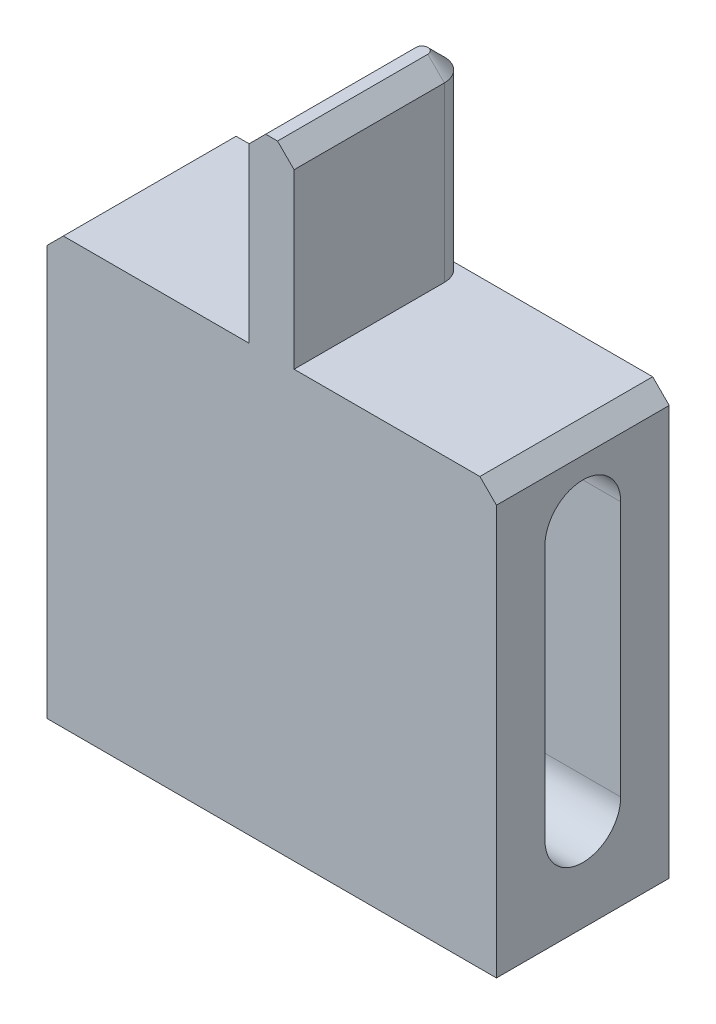
ISO-10303-21;
HEADER;
FILE_DESCRIPTION(('STEP AP214'),'2;1');
FILE_NAME('part.step','',(''),(''),'','','');
FILE_SCHEMA(('AUTOMOTIVE_DESIGN { 1 0 10303 214 1 1 1 1 }'));
ENDSEC;
DATA;
#1=APPLICATION_CONTEXT('core data for automotive mechanical design processes');
#2=APPLICATION_PROTOCOL_DEFINITION('international standard','automotive_design',2000,#1);
#3=PRODUCT_CONTEXT('',#1,'mechanical');
#4=PRODUCT('Part','Part','',(#3));
#5=PRODUCT_RELATED_PRODUCT_CATEGORY('part','',(#4));
#6=PRODUCT_DEFINITION_FORMATION('','',#4);
#7=PRODUCT_DEFINITION_CONTEXT('part definition',#1,'design');
#8=PRODUCT_DEFINITION('design','',#6,#7);
#9=PRODUCT_DEFINITION_SHAPE('','',#8);
#10=(LENGTH_UNIT() NAMED_UNIT(*) SI_UNIT(.MILLI.,.METRE.));
#11=(NAMED_UNIT(*) PLANE_ANGLE_UNIT() SI_UNIT($,.RADIAN.));
#12=(NAMED_UNIT(*) SI_UNIT($,.STERADIAN.) SOLID_ANGLE_UNIT());
#13=UNCERTAINTY_MEASURE_WITH_UNIT(LENGTH_MEASURE(1.E-05),#10,'distance_accuracy_value','');
#14=(GEOMETRIC_REPRESENTATION_CONTEXT(3) GLOBAL_UNCERTAINTY_ASSIGNED_CONTEXT((#13)) GLOBAL_UNIT_ASSIGNED_CONTEXT((#10,
#11,#12)) REPRESENTATION_CONTEXT('',''));
#15=CARTESIAN_POINT('',(0.,0.,0.));
#16=DIRECTION('',(0.,0.,1.));
#17=DIRECTION('',(1.,0.,0.));
#18=AXIS2_PLACEMENT_3D('',#15,#16,#17);
#19=CARTESIAN_POINT('',(8.54999999999998,26.,7.3));
#20=DIRECTION('',(0.,-1.,0.));
#21=DIRECTION('',(0.,0.,-1.));
#22=AXIS2_PLACEMENT_3D('',#19,#20,#21);
#23=PLANE('',#22);
#24=DIRECTION('',(-1.,0.,0.));
#25=VECTOR('',#24,1.);
#26=CARTESIAN_POINT('',(8.54999999999998,26.,7.3));
#27=LINE('',#26,#25);
#28=CARTESIAN_POINT('',(9.74999999999999,26.,7.3));
#29=VERTEX_POINT('',#28);
#30=CARTESIAN_POINT('',(9.24999999999998,26.,7.3));
#31=VERTEX_POINT('',#30);
#32=EDGE_CURVE('E217',#29,#31,#27,.T.);
#33=ORIENTED_EDGE('',*,*,#32,.F.);
#34=DIRECTION('',(0.,0.,-1.));
#35=VECTOR('',#34,1.);
#36=CARTESIAN_POINT('',(9.74999999999999,26.,7.3));
#37=LINE('',#36,#35);
#38=CARTESIAN_POINT('',(9.74999999999998,26.,0.95));
#39=VERTEX_POINT('',#38);
#40=EDGE_CURVE('E259',#29,#39,#37,.T.);
#41=ORIENTED_EDGE('',*,*,#40,.T.);
#42=CARTESIAN_POINT('',(9.49999999999998,26.,0.95));
#43=DIRECTION('',(0.,-1.,0.));
#44=DIRECTION('',(0.,0.,-1.));
#45=AXIS2_PLACEMENT_3D('',#42,#43,#44);
#46=CIRCLE('',#45,0.25);
#47=CARTESIAN_POINT('',(9.24999999999998,26.,0.95));
#48=VERTEX_POINT('',#47);
#49=EDGE_CURVE('E257',#39,#48,#46,.F.);
#50=ORIENTED_EDGE('',*,*,#49,.T.);
#51=DIRECTION('',(0.,0.,1.));
#52=VECTOR('',#51,1.);
#53=CARTESIAN_POINT('',(9.24999999999998,26.,7.3));
#54=LINE('',#53,#52);
#55=EDGE_CURVE('E255',#48,#31,#54,.T.);
#56=ORIENTED_EDGE('',*,*,#55,.T.);
#57=EDGE_LOOP('',(#33,#41,#50,#56));
#58=FACE_BOUND('',#57,.T.);
#59=ADVANCED_FACE('F35',(#58),#23,.F.);
#60=CARTESIAN_POINT('',(10.45,18.,7.3));
#61=DIRECTION('',(-1.,0.,0.));
#62=DIRECTION('',(0.,0.,1.));
#63=AXIS2_PLACEMENT_3D('',#60,#61,#62);
#64=PLANE('',#63);
#65=DIRECTION('',(0.,1.,0.));
#66=VECTOR('',#65,1.);
#67=CARTESIAN_POINT('',(10.45,16.6564971157456,0.95));
#68=LINE('',#67,#66);
#69=CARTESIAN_POINT('',(10.45,18.,0.95));
#70=VERTEX_POINT('',#69);
#71=CARTESIAN_POINT('',(10.45,25.3,0.95));
#72=VERTEX_POINT('',#71);
#73=EDGE_CURVE('E194',#70,#72,#68,.T.);
#74=ORIENTED_EDGE('',*,*,#73,.T.);
#75=DIRECTION('',(0.,0.,1.));
#76=VECTOR('',#75,1.);
#77=CARTESIAN_POINT('',(10.45,25.3,7.3));
#78=LINE('',#77,#76);
#79=CARTESIAN_POINT('',(10.45,25.3,7.3));
#80=VERTEX_POINT('',#79);
#81=EDGE_CURVE('E262',#72,#80,#78,.T.);
#82=ORIENTED_EDGE('',*,*,#81,.T.);
#83=DIRECTION('',(0.,1.,0.));
#84=VECTOR('',#83,1.);
#85=CARTESIAN_POINT('',(10.45,18.,7.3));
#86=LINE('',#85,#84);
#87=CARTESIAN_POINT('',(10.45,18.,7.3));
#88=VERTEX_POINT('',#87);
#89=EDGE_CURVE('E214',#88,#80,#86,.T.);
#90=ORIENTED_EDGE('',*,*,#89,.F.);
#91=DIRECTION('',(0.,0.,-1.));
#92=VECTOR('',#91,1.);
#93=CARTESIAN_POINT('',(10.45,18.,7.3));
#94=LINE('',#93,#92);
#95=EDGE_CURVE('E237',#88,#70,#94,.T.);
#96=ORIENTED_EDGE('',*,*,#95,.T.);
#97=EDGE_LOOP('',(#74,#82,#90,#96));
#98=FACE_BOUND('',#97,.T.);
#99=ADVANCED_FACE('F340',(#98),#64,.F.);
#100=CARTESIAN_POINT('',(0.,0.,7.3));
#101=DIRECTION('',(1.,0.,0.));
#102=DIRECTION('',(0.,0.,-1.));
#103=AXIS2_PLACEMENT_3D('',#100,#101,#102);
#104=PLANE('',#103);
#105=DIRECTION('',(0.,1.,0.));
#106=VECTOR('',#105,1.);
#107=CARTESIAN_POINT('',(0.,14.8,2.05));
#108=LINE('',#107,#106);
#109=CARTESIAN_POINT('',(0.,4.,2.05));
#110=VERTEX_POINT('',#109);
#111=CARTESIAN_POINT('',(0.,14.8,2.05));
#112=VERTEX_POINT('',#111);
#113=EDGE_CURVE('E166',#110,#112,#108,.T.);
#114=ORIENTED_EDGE('',*,*,#113,.T.);
#115=CARTESIAN_POINT('',(0.,14.8,3.65));
#116=DIRECTION('',(1.,0.,0.));
#117=DIRECTION('',(0.,0.,-1.));
#118=AXIS2_PLACEMENT_3D('',#115,#116,#117);
#119=CIRCLE('',#118,1.6);
#120=CARTESIAN_POINT('',(0.,14.8,5.25));
#121=VERTEX_POINT('',#120);
#122=EDGE_CURVE('E159',#112,#121,#119,.T.);
#123=ORIENTED_EDGE('',*,*,#122,.T.);
#124=DIRECTION('',(0.,-1.,0.));
#125=VECTOR('',#124,1.);
#126=CARTESIAN_POINT('',(0.,14.8,5.25));
#127=LINE('',#126,#125);
#128=CARTESIAN_POINT('',(0.,4.,5.25));
#129=VERTEX_POINT('',#128);
#130=EDGE_CURVE('E170',#121,#129,#127,.T.);
#131=ORIENTED_EDGE('',*,*,#130,.T.);
#132=CARTESIAN_POINT('',(0.,4.,3.65));
#133=DIRECTION('',(1.,0.,0.));
#134=DIRECTION('',(0.,0.,-1.));
#135=AXIS2_PLACEMENT_3D('',#132,#133,#134);
#136=CIRCLE('',#135,1.6);
#137=EDGE_CURVE('E175',#129,#110,#136,.T.);
#138=ORIENTED_EDGE('',*,*,#137,.T.);
#139=EDGE_LOOP('',(#114,#123,#131,#138));
#140=FACE_BOUND('',#139,.T.);
#141=DIRECTION('',(0.,-1.,0.));
#142=VECTOR('',#141,1.);
#143=CARTESIAN_POINT('',(0.,0.,7.3));
#144=LINE('',#143,#142);
#145=CARTESIAN_POINT('',(0.,17.3,7.3));
#146=VERTEX_POINT('',#145);
#147=CARTESIAN_POINT('',(0.,0.,7.3));
#148=VERTEX_POINT('',#147);
#149=EDGE_CURVE('E204',#146,#148,#144,.T.);
#150=ORIENTED_EDGE('',*,*,#149,.F.);
#151=DIRECTION('',(0.,0.,-1.));
#152=VECTOR('',#151,1.);
#153=CARTESIAN_POINT('',(0.,17.3,7.3));
#154=LINE('',#153,#152);
#155=CARTESIAN_POINT('',(0.,17.3,0.));
#156=VERTEX_POINT('',#155);
#157=EDGE_CURVE('E276',#146,#156,#154,.T.);
#158=ORIENTED_EDGE('',*,*,#157,.T.);
#159=DIRECTION('',(0.,-1.,0.));
#160=VECTOR('',#159,1.);
#161=CARTESIAN_POINT('',(0.,0.,0.));
#162=LINE('',#161,#160);
#163=CARTESIAN_POINT('',(0.,0.,0.));
#164=VERTEX_POINT('',#163);
#165=EDGE_CURVE('E201',#156,#164,#162,.T.);
#166=ORIENTED_EDGE('',*,*,#165,.T.);
#167=DIRECTION('',(0.,0.,-1.));
#168=VECTOR('',#167,1.);
#169=CARTESIAN_POINT('',(0.,0.,7.3));
#170=LINE('',#169,#168);
#171=EDGE_CURVE('E243',#148,#164,#170,.T.);
#172=ORIENTED_EDGE('',*,*,#171,.F.);
#173=EDGE_LOOP('',(#150,#158,#166,#172));
#174=FACE_BOUND('',#173,.T.);
#175=ADVANCED_FACE('F177',(#140,#174),#104,.F.);
#176=CARTESIAN_POINT('',(0.,0.,7.3));
#177=DIRECTION('',(0.,1.,0.));
#178=DIRECTION('',(0.,0.,1.));
#179=AXIS2_PLACEMENT_3D('',#176,#177,#178);
#180=PLANE('',#179);
#181=DIRECTION('',(1.,0.,0.));
#182=VECTOR('',#181,1.);
#183=CARTESIAN_POINT('',(0.,0.,0.));
#184=LINE('',#183,#182);
#185=CARTESIAN_POINT('',(19.,0.,0.));
#186=VERTEX_POINT('',#185);
#187=EDGE_CURVE('E227',#164,#186,#184,.T.);
#188=ORIENTED_EDGE('',*,*,#187,.T.);
#189=DIRECTION('',(0.,0.,-1.));
#190=VECTOR('',#189,1.);
#191=CARTESIAN_POINT('',(19.,0.,7.3));
#192=LINE('',#191,#190);
#193=CARTESIAN_POINT('',(19.,0.,7.3));
#194=VERTEX_POINT('',#193);
#195=EDGE_CURVE('E240',#194,#186,#192,.T.);
#196=ORIENTED_EDGE('',*,*,#195,.F.);
#197=DIRECTION('',(1.,0.,0.));
#198=VECTOR('',#197,1.);
#199=CARTESIAN_POINT('',(0.,0.,7.3));
#200=LINE('',#199,#198);
#201=EDGE_CURVE('E206',#148,#194,#200,.T.);
#202=ORIENTED_EDGE('',*,*,#201,.F.);
#203=ORIENTED_EDGE('',*,*,#171,.T.);
#204=EDGE_LOOP('',(#188,#196,#202,#203));
#205=FACE_BOUND('',#204,.T.);
#206=ADVANCED_FACE('F330',(#205),#180,.F.);
#207=CARTESIAN_POINT('',(19.,0.,7.3));
#208=DIRECTION('',(-1.,0.,0.));
#209=DIRECTION('',(0.,0.,1.));
#210=AXIS2_PLACEMENT_3D('',#207,#208,#209);
#211=PLANE('',#210);
#212=DIRECTION('',(0.,1.,0.));
#213=VECTOR('',#212,1.);
#214=CARTESIAN_POINT('',(19.,0.,5.25));
#215=LINE('',#214,#213);
#216=CARTESIAN_POINT('',(19.,4.,5.25));
#217=VERTEX_POINT('',#216);
#218=CARTESIAN_POINT('',(19.,14.8,5.25));
#219=VERTEX_POINT('',#218);
#220=EDGE_CURVE('E246',#217,#219,#215,.T.);
#221=ORIENTED_EDGE('',*,*,#220,.T.);
#222=CARTESIAN_POINT('',(19.,14.8,3.65));
#223=DIRECTION('',(1.,0.,0.));
#224=DIRECTION('',(0.,0.,-1.));
#225=AXIS2_PLACEMENT_3D('',#222,#223,#224);
#226=CIRCLE('',#225,1.6);
#227=CARTESIAN_POINT('',(19.,14.8,2.05));
#228=VERTEX_POINT('',#227);
#229=EDGE_CURVE('E162',#219,#228,#226,.F.);
#230=ORIENTED_EDGE('',*,*,#229,.T.);
#231=DIRECTION('',(0.,1.,0.));
#232=VECTOR('',#231,1.);
#233=CARTESIAN_POINT('',(19.,0.,2.05));
#234=LINE('',#233,#232);
#235=CARTESIAN_POINT('',(19.,4.,2.05));
#236=VERTEX_POINT('',#235);
#237=EDGE_CURVE('E251',#228,#236,#234,.F.);
#238=ORIENTED_EDGE('',*,*,#237,.T.);
#239=CARTESIAN_POINT('',(19.,4.,3.65));
#240=DIRECTION('',(1.,0.,0.));
#241=DIRECTION('',(0.,0.,-1.));
#242=AXIS2_PLACEMENT_3D('',#239,#240,#241);
#243=CIRCLE('',#242,1.6);
#244=EDGE_CURVE('E248',#236,#217,#243,.F.);
#245=ORIENTED_EDGE('',*,*,#244,.T.);
#246=EDGE_LOOP('',(#221,#230,#238,#245));
#247=FACE_BOUND('',#246,.T.);
#248=DIRECTION('',(0.,1.,0.));
#249=VECTOR('',#248,1.);
#250=CARTESIAN_POINT('',(19.,0.,0.));
#251=LINE('',#250,#249);
#252=CARTESIAN_POINT('',(19.,17.3,0.));
#253=VERTEX_POINT('',#252);
#254=EDGE_CURVE('E229',#186,#253,#251,.T.);
#255=ORIENTED_EDGE('',*,*,#254,.T.);
#256=DIRECTION('',(0.,0.,1.));
#257=VECTOR('',#256,1.);
#258=CARTESIAN_POINT('',(19.,17.3,7.3));
#259=LINE('',#258,#257);
#260=CARTESIAN_POINT('',(19.,17.3,7.3));
#261=VERTEX_POINT('',#260);
#262=EDGE_CURVE('E11',#253,#261,#259,.T.);
#263=ORIENTED_EDGE('',*,*,#262,.T.);
#264=DIRECTION('',(0.,1.,0.));
#265=VECTOR('',#264,1.);
#266=CARTESIAN_POINT('',(19.,0.,7.3));
#267=LINE('',#266,#265);
#268=EDGE_CURVE('E209',#194,#261,#267,.T.);
#269=ORIENTED_EDGE('',*,*,#268,.F.);
#270=ORIENTED_EDGE('',*,*,#195,.T.);
#271=EDGE_LOOP('',(#255,#263,#269,#270));
#272=FACE_BOUND('',#271,.T.);
#273=ADVANCED_FACE('F353',(#247,#272),#211,.F.);
#274=CARTESIAN_POINT('',(10.45,18.,7.3));
#275=DIRECTION('',(0.,-1.,0.));
#276=DIRECTION('',(0.,0.,-1.));
#277=AXIS2_PLACEMENT_3D('',#274,#275,#276);
#278=PLANE('',#277);
#279=DIRECTION('',(-1.,0.,0.));
#280=VECTOR('',#279,1.);
#281=CARTESIAN_POINT('',(10.45,18.,7.3));
#282=LINE('',#281,#280);
#283=CARTESIAN_POINT('',(18.3,18.,7.3));
#284=VERTEX_POINT('',#283);
#285=EDGE_CURVE('E212',#284,#88,#282,.T.);
#286=ORIENTED_EDGE('',*,*,#285,.F.);
#287=DIRECTION('',(0.,0.,-1.));
#288=VECTOR('',#287,1.);
#289=CARTESIAN_POINT('',(18.3,18.,7.3));
#290=LINE('',#289,#288);
#291=CARTESIAN_POINT('',(18.3,18.,0.));
#292=VERTEX_POINT('',#291);
#293=EDGE_CURVE('E45',#284,#292,#290,.T.);
#294=ORIENTED_EDGE('',*,*,#293,.T.);
#295=DIRECTION('',(-1.,0.,0.));
#296=VECTOR('',#295,1.);
#297=CARTESIAN_POINT('',(10.45,18.,0.));
#298=LINE('',#297,#296);
#299=CARTESIAN_POINT('',(9.49999999999998,18.,0.));
#300=VERTEX_POINT('',#299);
#301=EDGE_CURVE('E231',#292,#300,#298,.T.);
#302=ORIENTED_EDGE('',*,*,#301,.T.);
#303=CARTESIAN_POINT('',(9.49999999999998,18.,0.95));
#304=DIRECTION('',(0.,-1.,0.));
#305=DIRECTION('',(0.,0.,-1.));
#306=AXIS2_PLACEMENT_3D('',#303,#304,#305);
#307=CIRCLE('',#306,0.95);
#308=EDGE_CURVE('E190',#300,#70,#307,.T.);
#309=ORIENTED_EDGE('',*,*,#308,.T.);
#310=ORIENTED_EDGE('',*,*,#95,.F.);
#311=EDGE_LOOP('',(#286,#294,#302,#309,#310));
#312=FACE_BOUND('',#311,.T.);
#313=ADVANCED_FACE('F336',(#312),#278,.F.);
#314=CARTESIAN_POINT('',(8.54999999999999,18.,7.3));
#315=DIRECTION('',(1.,0.,0.));
#316=DIRECTION('',(0.,1.,0.));
#317=AXIS2_PLACEMENT_3D('',#314,#315,#316);
#318=PLANE('',#317);
#319=DIRECTION('',(0.,-1.,0.));
#320=VECTOR('',#319,1.);
#321=CARTESIAN_POINT('',(8.54999999999999,18.,7.3));
#322=LINE('',#321,#320);
#323=CARTESIAN_POINT('',(8.54999999999998,25.3,7.3));
#324=VERTEX_POINT('',#323);
#325=CARTESIAN_POINT('',(8.54999999999999,18.,7.3));
#326=VERTEX_POINT('',#325);
#327=EDGE_CURVE('E220',#324,#326,#322,.T.);
#328=ORIENTED_EDGE('',*,*,#327,.F.);
#329=DIRECTION('',(0.,0.,-1.));
#330=VECTOR('',#329,1.);
#331=CARTESIAN_POINT('',(8.54999999999998,25.3,7.3));
#332=LINE('',#331,#330);
#333=CARTESIAN_POINT('',(8.54999999999998,25.3,0.95));
#334=VERTEX_POINT('',#333);
#335=EDGE_CURVE('E274',#324,#334,#332,.T.);
#336=ORIENTED_EDGE('',*,*,#335,.T.);
#337=DIRECTION('',(0.,1.,0.));
#338=VECTOR('',#337,1.);
#339=CARTESIAN_POINT('',(8.54999999999998,16.6564971157456,0.95));
#340=LINE('',#339,#338);
#341=CARTESIAN_POINT('',(8.54999999999998,18.,0.95));
#342=VERTEX_POINT('',#341);
#343=EDGE_CURVE('E197',#342,#334,#340,.T.);
#344=ORIENTED_EDGE('',*,*,#343,.F.);
#345=DIRECTION('',(0.,0.,-1.));
#346=VECTOR('',#345,1.);
#347=CARTESIAN_POINT('',(8.54999999999999,18.,7.3));
#348=LINE('',#347,#346);
#349=EDGE_CURVE('E225',#326,#342,#348,.T.);
#350=ORIENTED_EDGE('',*,*,#349,.F.);
#351=EDGE_LOOP('',(#328,#336,#344,#350));
#352=FACE_BOUND('',#351,.T.);
#353=ADVANCED_FACE('F307',(#352),#318,.F.);
#354=CARTESIAN_POINT('',(0.,18.,7.3));
#355=DIRECTION('',(0.,-1.,0.));
#356=DIRECTION('',(0.,0.,-1.));
#357=AXIS2_PLACEMENT_3D('',#354,#355,#356);
#358=PLANE('',#357);
#359=DIRECTION('',(-1.,0.,0.));
#360=VECTOR('',#359,1.);
#361=CARTESIAN_POINT('',(0.,18.,0.));
#362=LINE('',#361,#360);
#363=CARTESIAN_POINT('',(0.699999999999999,18.,0.));
#364=VERTEX_POINT('',#363);
#365=EDGE_CURVE('E207',#300,#364,#362,.T.);
#366=ORIENTED_EDGE('',*,*,#365,.T.);
#367=DIRECTION('',(0.,0.,1.));
#368=VECTOR('',#367,1.);
#369=CARTESIAN_POINT('',(0.699999999999999,18.,7.3));
#370=LINE('',#369,#368);
#371=CARTESIAN_POINT('',(0.699999999999999,18.,7.3));
#372=VERTEX_POINT('',#371);
#373=EDGE_CURVE('E282',#364,#372,#370,.T.);
#374=ORIENTED_EDGE('',*,*,#373,.T.);
#375=DIRECTION('',(-1.,0.,0.));
#376=VECTOR('',#375,1.);
#377=CARTESIAN_POINT('',(0.,18.,7.3));
#378=LINE('',#377,#376);
#379=EDGE_CURVE('E222',#326,#372,#378,.T.);
#380=ORIENTED_EDGE('',*,*,#379,.F.);
#381=ORIENTED_EDGE('',*,*,#349,.T.);
#382=CARTESIAN_POINT('',(9.49999999999998,18.,0.95));
#383=DIRECTION('',(0.,-1.,0.));
#384=DIRECTION('',(0.,0.,-1.));
#385=AXIS2_PLACEMENT_3D('',#382,#383,#384);
#386=CIRCLE('',#385,0.95);
#387=EDGE_CURVE('E198',#342,#300,#386,.T.);
#388=ORIENTED_EDGE('',*,*,#387,.T.);
#389=EDGE_LOOP('',(#366,#374,#380,#381,#388));
#390=FACE_BOUND('',#389,.T.);
#391=ADVANCED_FACE('F315',(#390),#358,.F.);
#392=CARTESIAN_POINT('',(0.,0.,7.3));
#393=DIRECTION('',(0.,0.,-1.));
#394=DIRECTION('',(-1.,0.,0.));
#395=AXIS2_PLACEMENT_3D('',#392,#393,#394);
#396=PLANE('',#395);
#397=ORIENTED_EDGE('',*,*,#89,.T.);
#398=DIRECTION('',(0.707106781186546,-0.707106781186549,0.));
#399=VECTOR('',#398,1.);
#400=CARTESIAN_POINT('',(9.74999999999999,26.,7.3));
#401=LINE('',#400,#399);
#402=EDGE_CURVE('E270',#80,#29,#401,.F.);
#403=ORIENTED_EDGE('',*,*,#402,.T.);
#404=ORIENTED_EDGE('',*,*,#32,.T.);
#405=DIRECTION('',(0.707106781186548,0.707106781186548,0.));
#406=VECTOR('',#405,1.);
#407=CARTESIAN_POINT('',(8.54999999999998,25.3,7.3));
#408=LINE('',#407,#406);
#409=EDGE_CURVE('E268',#31,#324,#408,.F.);
#410=ORIENTED_EDGE('',*,*,#409,.T.);
#411=ORIENTED_EDGE('',*,*,#327,.T.);
#412=ORIENTED_EDGE('',*,*,#379,.T.);
#413=DIRECTION('',(0.707106781186548,0.707106781186548,0.));
#414=VECTOR('',#413,1.);
#415=CARTESIAN_POINT('',(0.,17.3,7.3));
#416=LINE('',#415,#414);
#417=EDGE_CURVE('E266',#372,#146,#416,.F.);
#418=ORIENTED_EDGE('',*,*,#417,.T.);
#419=ORIENTED_EDGE('',*,*,#149,.T.);
#420=ORIENTED_EDGE('',*,*,#201,.T.);
#421=ORIENTED_EDGE('',*,*,#268,.T.);
#422=DIRECTION('',(0.707106781186548,-0.707106781186548,0.));
#423=VECTOR('',#422,1.);
#424=CARTESIAN_POINT('',(18.3,18.,7.3));
#425=LINE('',#424,#423);
#426=EDGE_CURVE('E264',#261,#284,#425,.F.);
#427=ORIENTED_EDGE('',*,*,#426,.T.);
#428=ORIENTED_EDGE('',*,*,#285,.T.);
#429=EDGE_LOOP('',(#397,#403,#404,#410,#411,#412,#418,#419,#420,#421,#427,#428));
#430=FACE_BOUND('',#429,.T.);
#431=ADVANCED_FACE('F300',(#430),#396,.F.);
#432=CARTESIAN_POINT('',(0.,0.,0.));
#433=DIRECTION('',(0.,0.,-1.));
#434=DIRECTION('',(-1.,0.,0.));
#435=AXIS2_PLACEMENT_3D('',#432,#433,#434);
#436=PLANE('',#435);
#437=ORIENTED_EDGE('',*,*,#165,.F.);
#438=DIRECTION('',(-0.707106781186548,-0.707106781186548,0.));
#439=VECTOR('',#438,1.);
#440=CARTESIAN_POINT('',(-8.65,8.65,0.));
#441=LINE('',#440,#439);
#442=EDGE_CURVE('E280',#156,#364,#441,.F.);
#443=ORIENTED_EDGE('',*,*,#442,.T.);
#444=ORIENTED_EDGE('',*,*,#365,.F.);
#445=ORIENTED_EDGE('',*,*,#301,.F.);
#446=DIRECTION('',(-0.707106781186548,0.707106781186548,0.));
#447=VECTOR('',#446,1.);
#448=CARTESIAN_POINT('',(18.15,18.15,0.));
#449=LINE('',#448,#447);
#450=EDGE_CURVE('E53',#292,#253,#449,.F.);
#451=ORIENTED_EDGE('',*,*,#450,.T.);
#452=ORIENTED_EDGE('',*,*,#254,.F.);
#453=ORIENTED_EDGE('',*,*,#187,.F.);
#454=EDGE_LOOP('',(#437,#443,#444,#445,#451,#452,#453));
#455=FACE_BOUND('',#454,.T.);
#456=ADVANCED_FACE('F326',(#455),#436,.T.);
#457=CARTESIAN_POINT('',(9.49999999999998,16.6564971157456,0.95));
#458=DIRECTION('',(0.,1.,0.));
#459=DIRECTION('',(0.,0.,1.));
#460=AXIS2_PLACEMENT_3D('',#457,#458,#459);
#461=CYLINDRICAL_SURFACE('',#460,0.95);
#462=ORIENTED_EDGE('',*,*,#343,.T.);
#463=CARTESIAN_POINT('',(9.49999999999998,25.3,0.95));
#464=DIRECTION('',(0.,-1.,0.));
#465=DIRECTION('',(0.,0.,-1.));
#466=AXIS2_PLACEMENT_3D('',#463,#464,#465);
#467=CIRCLE('',#466,0.95);
#468=EDGE_CURVE('E272',#334,#72,#467,.T.);
#469=ORIENTED_EDGE('',*,*,#468,.T.);
#470=ORIENTED_EDGE('',*,*,#73,.F.);
#471=ORIENTED_EDGE('',*,*,#308,.F.);
#472=ORIENTED_EDGE('',*,*,#387,.F.);
#473=EDGE_LOOP('',(#462,#469,#470,#471,#472));
#474=FACE_BOUND('',#473,.T.);
#475=ADVANCED_FACE('F310',(#474),#461,.T.);
#476=CARTESIAN_POINT('',(0.,14.8,3.65));
#477=DIRECTION('',(1.,0.,0.));
#478=DIRECTION('',(0.,0.,-1.));
#479=AXIS2_PLACEMENT_3D('',#476,#477,#478);
#480=CYLINDRICAL_SURFACE('',#479,1.6);
#481=DIRECTION('',(1.,0.,0.));
#482=VECTOR('',#481,1.);
#483=CARTESIAN_POINT('',(0.,14.8,5.25));
#484=LINE('',#483,#482);
#485=EDGE_CURVE('E154',#121,#219,#484,.T.);
#486=ORIENTED_EDGE('',*,*,#485,.F.);
#487=ORIENTED_EDGE('',*,*,#122,.F.);
#488=DIRECTION('',(1.,0.,0.));
#489=VECTOR('',#488,1.);
#490=CARTESIAN_POINT('',(0.,14.8,2.05));
#491=LINE('',#490,#489);
#492=EDGE_CURVE('E189',#112,#228,#491,.T.);
#493=ORIENTED_EDGE('',*,*,#492,.T.);
#494=ORIENTED_EDGE('',*,*,#229,.F.);
#495=EDGE_LOOP('',(#486,#487,#493,#494));
#496=FACE_BOUND('',#495,.T.);
#497=ADVANCED_FACE('F156',(#496),#480,.F.);
#498=CARTESIAN_POINT('',(0.,14.8,2.05));
#499=DIRECTION('',(0.,0.,-1.));
#500=DIRECTION('',(0.,1.,0.));
#501=AXIS2_PLACEMENT_3D('',#498,#499,#500);
#502=PLANE('',#501);
#503=ORIENTED_EDGE('',*,*,#492,.F.);
#504=ORIENTED_EDGE('',*,*,#113,.F.);
#505=DIRECTION('',(1.,0.,0.));
#506=VECTOR('',#505,1.);
#507=CARTESIAN_POINT('',(0.,4.,2.05));
#508=LINE('',#507,#506);
#509=EDGE_CURVE('E186',#110,#236,#508,.T.);
#510=ORIENTED_EDGE('',*,*,#509,.T.);
#511=ORIENTED_EDGE('',*,*,#237,.F.);
#512=EDGE_LOOP('',(#503,#504,#510,#511));
#513=FACE_BOUND('',#512,.T.);
#514=ADVANCED_FACE('F495',(#513),#502,.F.);
#515=CARTESIAN_POINT('',(0.,4.,3.65));
#516=DIRECTION('',(1.,0.,0.));
#517=DIRECTION('',(0.,0.,-1.));
#518=AXIS2_PLACEMENT_3D('',#515,#516,#517);
#519=CYLINDRICAL_SURFACE('',#518,1.6);
#520=ORIENTED_EDGE('',*,*,#509,.F.);
#521=ORIENTED_EDGE('',*,*,#137,.F.);
#522=DIRECTION('',(1.,0.,0.));
#523=VECTOR('',#522,1.);
#524=CARTESIAN_POINT('',(0.,4.,5.25));
#525=LINE('',#524,#523);
#526=EDGE_CURVE('E165',#129,#217,#525,.T.);
#527=ORIENTED_EDGE('',*,*,#526,.T.);
#528=ORIENTED_EDGE('',*,*,#244,.F.);
#529=EDGE_LOOP('',(#520,#521,#527,#528));
#530=FACE_BOUND('',#529,.T.);
#531=ADVANCED_FACE('F486',(#530),#519,.F.);
#532=CARTESIAN_POINT('',(0.,14.8,5.25));
#533=DIRECTION('',(0.,0.,1.));
#534=DIRECTION('',(0.,-1.,0.));
#535=AXIS2_PLACEMENT_3D('',#532,#533,#534);
#536=PLANE('',#535);
#537=ORIENTED_EDGE('',*,*,#526,.F.);
#538=ORIENTED_EDGE('',*,*,#130,.F.);
#539=ORIENTED_EDGE('',*,*,#485,.T.);
#540=ORIENTED_EDGE('',*,*,#220,.F.);
#541=EDGE_LOOP('',(#537,#538,#539,#540));
#542=FACE_BOUND('',#541,.T.);
#543=ADVANCED_FACE('F171',(#542),#536,.F.);
#544=CARTESIAN_POINT('',(8.54999999999998,25.3,7.3));
#545=DIRECTION('',(0.707106781186547,-0.707106781186547,0.));
#546=DIRECTION('',(0.,0.,-1.));
#547=AXIS2_PLACEMENT_3D('',#544,#545,#546);
#548=PLANE('',#547);
#549=ORIENTED_EDGE('',*,*,#409,.F.);
#550=ORIENTED_EDGE('',*,*,#55,.F.);
#551=DIRECTION('',(0.707106781186547,0.707106781186547,0.));
#552=VECTOR('',#551,1.);
#553=CARTESIAN_POINT('',(8.54999999999998,25.3,0.95));
#554=LINE('',#553,#552);
#555=EDGE_CURVE('E40',#334,#48,#554,.T.);
#556=ORIENTED_EDGE('',*,*,#555,.F.);
#557=ORIENTED_EDGE('',*,*,#335,.F.);
#558=EDGE_LOOP('',(#549,#550,#556,#557));
#559=FACE_BOUND('',#558,.T.);
#560=ADVANCED_FACE('F304',(#559),#548,.F.);
#561=CARTESIAN_POINT('',(9.49999999999998,25.3,0.95));
#562=DIRECTION('',(0.,-1.,0.));
#563=DIRECTION('',(0.,0.,-1.));
#564=AXIS2_PLACEMENT_3D('',#561,#562,#563);
#565=CONICAL_SURFACE('',#564,0.95,0.785398163397449);
#566=ORIENTED_EDGE('',*,*,#555,.T.);
#567=ORIENTED_EDGE('',*,*,#49,.F.);
#568=DIRECTION('',(-0.707106781186547,0.707106781186547,0.));
#569=VECTOR('',#568,1.);
#570=CARTESIAN_POINT('',(10.45,25.3,0.95));
#571=LINE('',#570,#569);
#572=EDGE_CURVE('E182',#72,#39,#571,.T.);
#573=ORIENTED_EDGE('',*,*,#572,.F.);
#574=ORIENTED_EDGE('',*,*,#468,.F.);
#575=EDGE_LOOP('',(#566,#567,#573,#574));
#576=FACE_BOUND('',#575,.T.);
#577=ADVANCED_FACE('F293',(#576),#565,.T.);
#578=CARTESIAN_POINT('',(9.74999999999999,26.,7.3));
#579=DIRECTION('',(-0.707106781186549,-0.707106781186546,0.));
#580=DIRECTION('',(0.,0.,-1.));
#581=AXIS2_PLACEMENT_3D('',#578,#579,#580);
#582=PLANE('',#581);
#583=ORIENTED_EDGE('',*,*,#402,.F.);
#584=ORIENTED_EDGE('',*,*,#81,.F.);
#585=ORIENTED_EDGE('',*,*,#572,.T.);
#586=ORIENTED_EDGE('',*,*,#40,.F.);
#587=EDGE_LOOP('',(#583,#584,#585,#586));
#588=FACE_BOUND('',#587,.T.);
#589=ADVANCED_FACE('F290',(#588),#582,.F.);
#590=CARTESIAN_POINT('',(0.,17.3,7.3));
#591=DIRECTION('',(0.707106781186547,-0.707106781186547,0.));
#592=DIRECTION('',(0.,0.,-1.));
#593=AXIS2_PLACEMENT_3D('',#590,#591,#592);
#594=PLANE('',#593);
#595=ORIENTED_EDGE('',*,*,#417,.F.);
#596=ORIENTED_EDGE('',*,*,#373,.F.);
#597=ORIENTED_EDGE('',*,*,#442,.F.);
#598=ORIENTED_EDGE('',*,*,#157,.F.);
#599=EDGE_LOOP('',(#595,#596,#597,#598));
#600=FACE_BOUND('',#599,.T.);
#601=ADVANCED_FACE('F322',(#600),#594,.F.);
#602=CARTESIAN_POINT('',(18.3,18.,7.3));
#603=DIRECTION('',(-0.707106781186547,-0.707106781186547,0.));
#604=DIRECTION('',(0.,0.,-1.));
#605=AXIS2_PLACEMENT_3D('',#602,#603,#604);
#606=PLANE('',#605);
#607=ORIENTED_EDGE('',*,*,#426,.F.);
#608=ORIENTED_EDGE('',*,*,#262,.F.);
#609=ORIENTED_EDGE('',*,*,#450,.F.);
#610=ORIENTED_EDGE('',*,*,#293,.F.);
#611=EDGE_LOOP('',(#607,#608,#609,#610));
#612=FACE_BOUND('',#611,.T.);
#613=ADVANCED_FACE('F38',(#612),#606,.F.);
#614=CLOSED_SHELL('',(#59,#99,#175,#206,#273,#313,#353,#391,#431,#456,#475,#497,#514,#531,#543,
#560,#577,#589,#601,#613));
#615=MANIFOLD_SOLID_BREP('B2',#614);
#616=ADVANCED_BREP_SHAPE_REPRESENTATION('',(#18,#615),#14);
#617=SHAPE_DEFINITION_REPRESENTATION(#9,#616);
ENDSEC;
END-ISO-10303-21;
